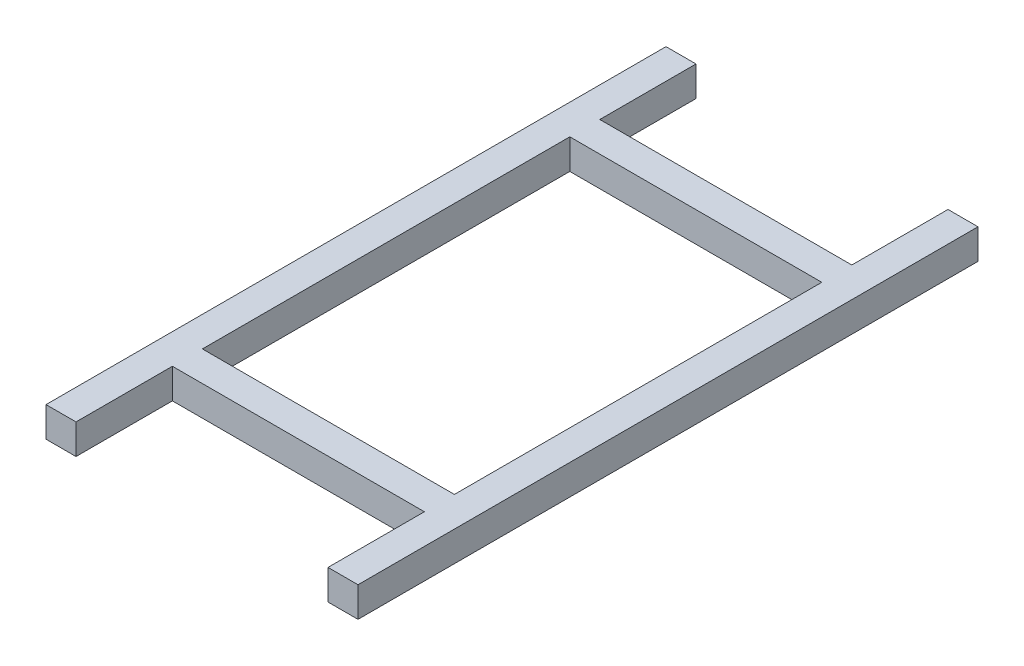
ISO-10303-21;
HEADER;
FILE_DESCRIPTION(('STEP AP214'),'2;1');
FILE_NAME('part.step','',(''),(''),'','','');
FILE_SCHEMA(('AUTOMOTIVE_DESIGN { 1 0 10303 214 1 1 1 1 }'));
ENDSEC;
DATA;
#1=APPLICATION_CONTEXT('core data for automotive mechanical design processes');
#2=APPLICATION_PROTOCOL_DEFINITION('international standard','automotive_design',2000,#1);
#3=PRODUCT_CONTEXT('',#1,'mechanical');
#4=PRODUCT('Part','Part','',(#3));
#5=PRODUCT_RELATED_PRODUCT_CATEGORY('part','',(#4));
#6=PRODUCT_DEFINITION_FORMATION('','',#4);
#7=PRODUCT_DEFINITION_CONTEXT('part definition',#1,'design');
#8=PRODUCT_DEFINITION('design','',#6,#7);
#9=PRODUCT_DEFINITION_SHAPE('','',#8);
#10=(LENGTH_UNIT() NAMED_UNIT(*) SI_UNIT(.MILLI.,.METRE.));
#11=(NAMED_UNIT(*) PLANE_ANGLE_UNIT() SI_UNIT($,.RADIAN.));
#12=(NAMED_UNIT(*) SI_UNIT($,.STERADIAN.) SOLID_ANGLE_UNIT());
#13=UNCERTAINTY_MEASURE_WITH_UNIT(LENGTH_MEASURE(1.E-05),#10,'distance_accuracy_value','');
#14=(GEOMETRIC_REPRESENTATION_CONTEXT(3) GLOBAL_UNCERTAINTY_ASSIGNED_CONTEXT((#13)) GLOBAL_UNIT_ASSIGNED_CONTEXT((#10,
#11,#12)) REPRESENTATION_CONTEXT('',''));
#15=CARTESIAN_POINT('',(0.,0.,0.));
#16=DIRECTION('',(0.,0.,1.));
#17=DIRECTION('',(1.,0.,0.));
#18=AXIS2_PLACEMENT_3D('',#15,#16,#17);
#19=CARTESIAN_POINT('',(80.1159358947742,31.4602637342031,3100.));
#20=DIRECTION('',(-1.,0.,0.));
#21=DIRECTION('',(0.,0.,1.));
#22=AXIS2_PLACEMENT_3D('',#19,#20,#21);
#23=PLANE('',#22);
#24=DIRECTION('',(0.,-1.,0.));
#25=VECTOR('',#24,1.);
#26=CARTESIAN_POINT('',(80.1159358947742,-118.539736265797,630.982528713376));
#27=LINE('',#26,#25);
#28=CARTESIAN_POINT('',(80.1159358947742,31.4602637342031,630.982528713376));
#29=VERTEX_POINT('',#28);
#30=CARTESIAN_POINT('',(80.1159358947742,-118.539736265797,630.982528713376));
#31=VERTEX_POINT('',#30);
#32=EDGE_CURVE('E167',#29,#31,#27,.T.);
#33=ORIENTED_EDGE('',*,*,#32,.F.);
#34=DIRECTION('',(0.,0.,-1.));
#35=VECTOR('',#34,1.);
#36=CARTESIAN_POINT('',(80.1159358947742,31.4602637342031,3100.));
#37=LINE('',#36,#35);
#38=CARTESIAN_POINT('',(80.1159358947742,31.4602637342031,2468.));
#39=VERTEX_POINT('',#38);
#40=EDGE_CURVE('E191',#39,#29,#37,.T.);
#41=ORIENTED_EDGE('',*,*,#40,.F.);
#42=DIRECTION('',(0.,1.,0.));
#43=VECTOR('',#42,1.);
#44=CARTESIAN_POINT('',(80.1159358947742,-118.539736265797,2468.));
#45=LINE('',#44,#43);
#46=CARTESIAN_POINT('',(80.1159358947742,-118.539736265797,2468.));
#47=VERTEX_POINT('',#46);
#48=EDGE_CURVE('E175',#47,#39,#45,.T.);
#49=ORIENTED_EDGE('',*,*,#48,.F.);
#50=DIRECTION('',(0.,0.,-1.));
#51=VECTOR('',#50,1.);
#52=CARTESIAN_POINT('',(80.1159358947742,-118.539736265797,3100.));
#53=LINE('',#52,#51);
#54=EDGE_CURVE('E158',#47,#31,#53,.T.);
#55=ORIENTED_EDGE('',*,*,#54,.T.);
#56=EDGE_LOOP('',(#33,#41,#49,#55));
#57=FACE_BOUND('',#56,.T.);
#58=ADVANCED_FACE('F34',(#57),#23,.F.);
#59=DIRECTION('',(0.,1.,0.));
#60=VECTOR('',#59,1.);
#61=CARTESIAN_POINT('',(80.1159358947742,-118.539736265797,480.982528713376));
#62=LINE('',#61,#60);
#63=CARTESIAN_POINT('',(80.1159358947742,-118.539736265797,480.982528713376));
#64=VERTEX_POINT('',#63);
#65=CARTESIAN_POINT('',(80.1159358947742,31.4602637342031,480.982528713376));
#66=VERTEX_POINT('',#65);
#67=EDGE_CURVE('E52',#64,#66,#62,.T.);
#68=ORIENTED_EDGE('',*,*,#67,.F.);
#69=CARTESIAN_POINT('',(80.1159358947742,-118.539736265797,0.));
#70=VERTEX_POINT('',#69);
#71=EDGE_CURVE('E38',#64,#70,#53,.T.);
#72=ORIENTED_EDGE('',*,*,#71,.T.);
#73=DIRECTION('',(0.,1.,0.));
#74=VECTOR('',#73,1.);
#75=CARTESIAN_POINT('',(80.1159358947742,31.4602637342031,0.));
#76=LINE('',#75,#74);
#77=CARTESIAN_POINT('',(80.1159358947742,31.4602637342031,0.));
#78=VERTEX_POINT('',#77);
#79=EDGE_CURVE('E274',#70,#78,#76,.T.);
#80=ORIENTED_EDGE('',*,*,#79,.T.);
#81=EDGE_CURVE('E192',#66,#78,#37,.T.);
#82=ORIENTED_EDGE('',*,*,#81,.F.);
#83=EDGE_LOOP('',(#68,#72,#80,#82));
#84=FACE_BOUND('',#83,.T.);
#85=ADVANCED_FACE('F271',(#84),#23,.F.);
#86=CARTESIAN_POINT('',(1340.11593589477,31.4602637342031,3100.));
#87=DIRECTION('',(1.,0.,0.));
#88=DIRECTION('',(0.,0.,-1.));
#89=AXIS2_PLACEMENT_3D('',#86,#87,#88);
#90=PLANE('',#89);
#91=DIRECTION('',(0.,-1.,0.));
#92=VECTOR('',#91,1.);
#93=CARTESIAN_POINT('',(1340.1159358948,-118.539736265797,630.982528713376));
#94=LINE('',#93,#92);
#95=CARTESIAN_POINT('',(1340.11593589477,31.4602637342031,630.982528713376));
#96=VERTEX_POINT('',#95);
#97=CARTESIAN_POINT('',(1340.11593589477,-118.539736265797,630.982528713376));
#98=VERTEX_POINT('',#97);
#99=EDGE_CURVE('E163',#96,#98,#94,.T.);
#100=ORIENTED_EDGE('',*,*,#99,.T.);
#101=DIRECTION('',(0.,0.,-1.));
#102=VECTOR('',#101,1.);
#103=CARTESIAN_POINT('',(1340.11593589477,-118.539736265797,3100.));
#104=LINE('',#103,#102);
#105=CARTESIAN_POINT('',(1340.1159358948,-118.539736265797,2468.));
#106=VERTEX_POINT('',#105);
#107=EDGE_CURVE('E161',#106,#98,#104,.T.);
#108=ORIENTED_EDGE('',*,*,#107,.F.);
#109=DIRECTION('',(0.,1.,0.));
#110=VECTOR('',#109,1.);
#111=CARTESIAN_POINT('',(1340.1159358948,-118.539736265797,2468.));
#112=LINE('',#111,#110);
#113=CARTESIAN_POINT('',(1340.11593589477,31.4602637342031,2468.));
#114=VERTEX_POINT('',#113);
#115=EDGE_CURVE('E294',#106,#114,#112,.T.);
#116=ORIENTED_EDGE('',*,*,#115,.T.);
#117=DIRECTION('',(0.,0.,-1.));
#118=VECTOR('',#117,1.);
#119=CARTESIAN_POINT('',(1340.11593589477,31.4602637342031,3100.));
#120=LINE('',#119,#118);
#121=EDGE_CURVE('E60',#114,#96,#120,.T.);
#122=ORIENTED_EDGE('',*,*,#121,.T.);
#123=EDGE_LOOP('',(#100,#108,#116,#122));
#124=FACE_BOUND('',#123,.T.);
#125=ADVANCED_FACE('F355',(#124),#90,.F.);
#126=DIRECTION('',(0.,1.,0.));
#127=VECTOR('',#126,1.);
#128=CARTESIAN_POINT('',(1340.1159358948,-118.539736265797,480.982528713376));
#129=LINE('',#128,#127);
#130=CARTESIAN_POINT('',(1340.11593589477,-118.539736265797,480.982528713376));
#131=VERTEX_POINT('',#130);
#132=CARTESIAN_POINT('',(1340.1159358948,31.4602637342031,480.982528713376));
#133=VERTEX_POINT('',#132);
#134=EDGE_CURVE('E257',#131,#133,#129,.T.);
#135=ORIENTED_EDGE('',*,*,#134,.T.);
#136=CARTESIAN_POINT('',(1340.11593589477,31.4602637342031,0.));
#137=VERTEX_POINT('',#136);
#138=EDGE_CURVE('E202',#133,#137,#120,.T.);
#139=ORIENTED_EDGE('',*,*,#138,.T.);
#140=DIRECTION('',(0.,-1.,0.));
#141=VECTOR('',#140,1.);
#142=CARTESIAN_POINT('',(1340.11593589477,31.4602637342031,0.));
#143=LINE('',#142,#141);
#144=CARTESIAN_POINT('',(1340.11593589477,-118.539736265797,0.));
#145=VERTEX_POINT('',#144);
#146=EDGE_CURVE('E248',#137,#145,#143,.T.);
#147=ORIENTED_EDGE('',*,*,#146,.T.);
#148=EDGE_CURVE('E206',#131,#145,#104,.T.);
#149=ORIENTED_EDGE('',*,*,#148,.F.);
#150=EDGE_LOOP('',(#135,#139,#147,#149));
#151=FACE_BOUND('',#150,.T.);
#152=ADVANCED_FACE('F349',(#151),#90,.F.);
#153=DIRECTION('',(0.,-1.,0.));
#154=VECTOR('',#153,1.);
#155=CARTESIAN_POINT('',(80.1159358947742,-118.539736265797,2618.));
#156=LINE('',#155,#154);
#157=CARTESIAN_POINT('',(80.1159358947742,31.4602637342031,2618.));
#158=VERTEX_POINT('',#157);
#159=CARTESIAN_POINT('',(80.1159358947742,-118.539736265797,2618.));
#160=VERTEX_POINT('',#159);
#161=EDGE_CURVE('E313',#158,#160,#156,.T.);
#162=ORIENTED_EDGE('',*,*,#161,.F.);
#163=CARTESIAN_POINT('',(80.1159358947742,31.4602637342031,3100.));
#164=VERTEX_POINT('',#163);
#165=EDGE_CURVE('E178',#164,#158,#37,.T.);
#166=ORIENTED_EDGE('',*,*,#165,.F.);
#167=DIRECTION('',(0.,1.,0.));
#168=VECTOR('',#167,1.);
#169=CARTESIAN_POINT('',(80.1159358947742,31.4602637342031,3100.));
#170=LINE('',#169,#168);
#171=CARTESIAN_POINT('',(80.1159358947742,-118.539736265797,3100.));
#172=VERTEX_POINT('',#171);
#173=EDGE_CURVE('E296',#172,#164,#170,.T.);
#174=ORIENTED_EDGE('',*,*,#173,.F.);
#175=EDGE_CURVE('E44',#172,#160,#53,.T.);
#176=ORIENTED_EDGE('',*,*,#175,.T.);
#177=EDGE_LOOP('',(#162,#166,#174,#176));
#178=FACE_BOUND('',#177,.T.);
#179=ADVANCED_FACE('F337',(#178),#23,.F.);
#180=CARTESIAN_POINT('',(-69.8840641052258,31.4602637342031,3100.));
#181=DIRECTION('',(1.,0.,0.));
#182=DIRECTION('',(0.,0.,-1.));
#183=AXIS2_PLACEMENT_3D('',#180,#181,#182);
#184=PLANE('',#183);
#185=DIRECTION('',(0.,-1.,0.));
#186=VECTOR('',#185,1.);
#187=CARTESIAN_POINT('',(-69.8840641052258,31.4602637342031,0.));
#188=LINE('',#187,#186);
#189=CARTESIAN_POINT('',(-69.8840641052258,31.4602637342031,0.));
#190=VERTEX_POINT('',#189);
#191=CARTESIAN_POINT('',(-69.8840641052258,-118.539736265797,0.));
#192=VERTEX_POINT('',#191);
#193=EDGE_CURVE('E284',#190,#192,#188,.T.);
#194=ORIENTED_EDGE('',*,*,#193,.T.);
#195=DIRECTION('',(0.,0.,-1.));
#196=VECTOR('',#195,1.);
#197=CARTESIAN_POINT('',(-69.8840641052258,-118.539736265797,3100.));
#198=LINE('',#197,#196);
#199=CARTESIAN_POINT('',(-69.8840641052258,-118.539736265797,3100.));
#200=VERTEX_POINT('',#199);
#201=EDGE_CURVE('E11',#200,#192,#198,.T.);
#202=ORIENTED_EDGE('',*,*,#201,.F.);
#203=DIRECTION('',(0.,-1.,0.));
#204=VECTOR('',#203,1.);
#205=CARTESIAN_POINT('',(-69.8840641052258,31.4602637342031,3100.));
#206=LINE('',#205,#204);
#207=CARTESIAN_POINT('',(-69.8840641052258,31.4602637342031,3100.));
#208=VERTEX_POINT('',#207);
#209=EDGE_CURVE('E286',#208,#200,#206,.T.);
#210=ORIENTED_EDGE('',*,*,#209,.F.);
#211=DIRECTION('',(0.,0.,-1.));
#212=VECTOR('',#211,1.);
#213=CARTESIAN_POINT('',(-69.8840641052258,31.4602637342031,3100.));
#214=LINE('',#213,#212);
#215=EDGE_CURVE('E195',#208,#190,#214,.T.);
#216=ORIENTED_EDGE('',*,*,#215,.T.);
#217=EDGE_LOOP('',(#194,#202,#210,#216));
#218=FACE_BOUND('',#217,.T.);
#219=ADVANCED_FACE('F36',(#218),#184,.F.);
#220=CARTESIAN_POINT('',(-69.8840641052258,-118.539736265797,3100.));
#221=DIRECTION('',(0.,1.,0.));
#222=DIRECTION('',(0.,0.,1.));
#223=AXIS2_PLACEMENT_3D('',#220,#221,#222);
#224=PLANE('',#223);
#225=ORIENTED_EDGE('',*,*,#71,.F.);
#226=DIRECTION('',(-1.,0.,0.));
#227=VECTOR('',#226,1.);
#228=CARTESIAN_POINT('',(500000.,-118.539736265797,480.982528713376));
#229=LINE('',#228,#227);
#230=EDGE_CURVE('E164',#131,#64,#229,.T.);
#231=ORIENTED_EDGE('',*,*,#230,.F.);
#232=ORIENTED_EDGE('',*,*,#148,.T.);
#233=DIRECTION('',(1.,0.,0.));
#234=VECTOR('',#233,1.);
#235=CARTESIAN_POINT('',(1340.11593589477,-118.539736265797,0.));
#236=LINE('',#235,#234);
#237=CARTESIAN_POINT('',(1490.11593589477,-118.539736265797,0.));
#238=VERTEX_POINT('',#237);
#239=EDGE_CURVE('E253',#145,#238,#236,.T.);
#240=ORIENTED_EDGE('',*,*,#239,.T.);
#241=DIRECTION('',(0.,0.,-1.));
#242=VECTOR('',#241,1.);
#243=CARTESIAN_POINT('',(1490.11593589477,-118.539736265797,3100.));
#244=LINE('',#243,#242);
#245=CARTESIAN_POINT('',(1490.11593589477,-118.539736265797,3100.));
#246=VERTEX_POINT('',#245);
#247=EDGE_CURVE('E227',#246,#238,#244,.T.);
#248=ORIENTED_EDGE('',*,*,#247,.F.);
#249=DIRECTION('',(1.,0.,0.));
#250=VECTOR('',#249,1.);
#251=CARTESIAN_POINT('',(1340.11593589477,-118.539736265797,3100.));
#252=LINE('',#251,#250);
#253=CARTESIAN_POINT('',(1340.11593589477,-118.539736265797,3100.));
#254=VERTEX_POINT('',#253);
#255=EDGE_CURVE('E251',#254,#246,#252,.T.);
#256=ORIENTED_EDGE('',*,*,#255,.F.);
#257=CARTESIAN_POINT('',(1340.1159358948,-118.539736265797,2618.));
#258=VERTEX_POINT('',#257);
#259=EDGE_CURVE('E225',#254,#258,#104,.T.);
#260=ORIENTED_EDGE('',*,*,#259,.T.);
#261=DIRECTION('',(-1.,0.,0.));
#262=VECTOR('',#261,1.);
#263=CARTESIAN_POINT('',(500000.,-118.539736265797,2618.));
#264=LINE('',#263,#262);
#265=EDGE_CURVE('E306',#258,#160,#264,.T.);
#266=ORIENTED_EDGE('',*,*,#265,.T.);
#267=ORIENTED_EDGE('',*,*,#175,.F.);
#268=DIRECTION('',(1.,0.,0.));
#269=VECTOR('',#268,1.);
#270=CARTESIAN_POINT('',(-69.8840641052258,-118.539736265797,3100.));
#271=LINE('',#270,#269);
#272=EDGE_CURVE('E289',#200,#172,#271,.T.);
#273=ORIENTED_EDGE('',*,*,#272,.F.);
#274=ORIENTED_EDGE('',*,*,#201,.T.);
#275=DIRECTION('',(1.,0.,0.));
#276=VECTOR('',#275,1.);
#277=CARTESIAN_POINT('',(-69.8840641052258,-118.539736265797,0.));
#278=LINE('',#277,#276);
#279=EDGE_CURVE('E279',#192,#70,#278,.T.);
#280=ORIENTED_EDGE('',*,*,#279,.T.);
#281=EDGE_LOOP('',(#225,#231,#232,#240,#248,#256,#260,#266,#267,#273,#274,#280));
#282=FACE_BOUND('',#281,.T.);
#283=DIRECTION('',(-1.,0.,0.));
#284=VECTOR('',#283,1.);
#285=CARTESIAN_POINT('',(500000.,-118.539736265797,630.982528713376));
#286=LINE('',#285,#284);
#287=EDGE_CURVE('E153',#98,#31,#286,.T.);
#288=ORIENTED_EDGE('',*,*,#287,.T.);
#289=ORIENTED_EDGE('',*,*,#54,.F.);
#290=DIRECTION('',(-1.,0.,0.));
#291=VECTOR('',#290,1.);
#292=CARTESIAN_POINT('',(500000.,-118.539736265797,2468.));
#293=LINE('',#292,#291);
#294=EDGE_CURVE('E323',#106,#47,#293,.T.);
#295=ORIENTED_EDGE('',*,*,#294,.F.);
#296=ORIENTED_EDGE('',*,*,#107,.T.);
#297=EDGE_LOOP('',(#288,#289,#295,#296));
#298=FACE_BOUND('',#297,.T.);
#299=ADVANCED_FACE('F155',(#282,#298),#224,.F.);
#300=CARTESIAN_POINT('',(-69.8840641052258,31.4602637342031,3100.));
#301=DIRECTION('',(0.,-1.,0.));
#302=DIRECTION('',(0.,0.,-1.));
#303=AXIS2_PLACEMENT_3D('',#300,#301,#302);
#304=PLANE('',#303);
#305=ORIENTED_EDGE('',*,*,#40,.T.);
#306=DIRECTION('',(-1.,0.,0.));
#307=VECTOR('',#306,1.);
#308=CARTESIAN_POINT('',(500000.,31.4602637342031,630.982528713376));
#309=LINE('',#308,#307);
#310=EDGE_CURVE('E170',#96,#29,#309,.T.);
#311=ORIENTED_EDGE('',*,*,#310,.F.);
#312=ORIENTED_EDGE('',*,*,#121,.F.);
#313=DIRECTION('',(-1.,0.,0.));
#314=VECTOR('',#313,1.);
#315=CARTESIAN_POINT('',(500000.,31.4602637342031,2468.));
#316=LINE('',#315,#314);
#317=EDGE_CURVE('E181',#114,#39,#316,.T.);
#318=ORIENTED_EDGE('',*,*,#317,.T.);
#319=EDGE_LOOP('',(#305,#311,#312,#318));
#320=FACE_BOUND('',#319,.T.);
#321=DIRECTION('',(-1.,0.,0.));
#322=VECTOR('',#321,1.);
#323=CARTESIAN_POINT('',(-69.8840641052258,31.4602637342031,0.));
#324=LINE('',#323,#322);
#325=EDGE_CURVE('E278',#78,#190,#324,.T.);
#326=ORIENTED_EDGE('',*,*,#325,.T.);
#327=ORIENTED_EDGE('',*,*,#215,.F.);
#328=DIRECTION('',(-1.,0.,0.));
#329=VECTOR('',#328,1.);
#330=CARTESIAN_POINT('',(-69.8840641052258,31.4602637342031,3100.));
#331=LINE('',#330,#329);
#332=EDGE_CURVE('E200',#164,#208,#331,.T.);
#333=ORIENTED_EDGE('',*,*,#332,.F.);
#334=ORIENTED_EDGE('',*,*,#165,.T.);
#335=DIRECTION('',(-1.,0.,0.));
#336=VECTOR('',#335,1.);
#337=CARTESIAN_POINT('',(500000.,31.4602637342031,2618.));
#338=LINE('',#337,#336);
#339=CARTESIAN_POINT('',(1340.1159358948,31.4602637342031,2618.));
#340=VERTEX_POINT('',#339);
#341=EDGE_CURVE('E310',#340,#158,#338,.T.);
#342=ORIENTED_EDGE('',*,*,#341,.F.);
#343=CARTESIAN_POINT('',(1340.11593589477,31.4602637342031,3100.));
#344=VERTEX_POINT('',#343);
#345=EDGE_CURVE('E221',#344,#340,#120,.T.);
#346=ORIENTED_EDGE('',*,*,#345,.F.);
#347=DIRECTION('',(-1.,0.,0.));
#348=VECTOR('',#347,1.);
#349=CARTESIAN_POINT('',(1340.11593589477,31.4602637342031,3100.));
#350=LINE('',#349,#348);
#351=CARTESIAN_POINT('',(1490.11593589477,31.4602637342031,3100.));
#352=VERTEX_POINT('',#351);
#353=EDGE_CURVE('E205',#352,#344,#350,.T.);
#354=ORIENTED_EDGE('',*,*,#353,.F.);
#355=DIRECTION('',(0.,0.,-1.));
#356=VECTOR('',#355,1.);
#357=CARTESIAN_POINT('',(1490.11593589477,31.4602637342031,3100.));
#358=LINE('',#357,#356);
#359=CARTESIAN_POINT('',(1490.11593589477,31.4602637342031,0.));
#360=VERTEX_POINT('',#359);
#361=EDGE_CURVE('E214',#352,#360,#358,.T.);
#362=ORIENTED_EDGE('',*,*,#361,.T.);
#363=DIRECTION('',(-1.,0.,0.));
#364=VECTOR('',#363,1.);
#365=CARTESIAN_POINT('',(1340.11593589477,31.4602637342031,0.));
#366=LINE('',#365,#364);
#367=EDGE_CURVE('E212',#360,#137,#366,.T.);
#368=ORIENTED_EDGE('',*,*,#367,.T.);
#369=ORIENTED_EDGE('',*,*,#138,.F.);
#370=DIRECTION('',(-1.,0.,0.));
#371=VECTOR('',#370,1.);
#372=CARTESIAN_POINT('',(500000.,31.4602637342031,480.982528713376));
#373=LINE('',#372,#371);
#374=EDGE_CURVE('E266',#133,#66,#373,.T.);
#375=ORIENTED_EDGE('',*,*,#374,.T.);
#376=ORIENTED_EDGE('',*,*,#81,.T.);
#377=EDGE_LOOP('',(#326,#327,#333,#334,#342,#346,#354,#362,#368,#369,#375,#376));
#378=FACE_BOUND('',#377,.T.);
#379=ADVANCED_FACE('F240',(#320,#378),#304,.F.);
#380=CARTESIAN_POINT('',(-69.8840641052258,-118.539736265797,3100.));
#381=DIRECTION('',(0.,0.,1.));
#382=DIRECTION('',(1.,0.,0.));
#383=AXIS2_PLACEMENT_3D('',#380,#381,#382);
#384=PLANE('',#383);
#385=ORIENTED_EDGE('',*,*,#209,.T.);
#386=ORIENTED_EDGE('',*,*,#272,.T.);
#387=ORIENTED_EDGE('',*,*,#173,.T.);
#388=ORIENTED_EDGE('',*,*,#332,.T.);
#389=EDGE_LOOP('',(#385,#386,#387,#388));
#390=FACE_BOUND('',#389,.T.);
#391=ADVANCED_FACE('F341',(#390),#384,.T.);
#392=CARTESIAN_POINT('',(-69.8840641052258,-118.539736265797,0.));
#393=DIRECTION('',(0.,0.,1.));
#394=DIRECTION('',(1.,0.,0.));
#395=AXIS2_PLACEMENT_3D('',#392,#393,#394);
#396=PLANE('',#395);
#397=ORIENTED_EDGE('',*,*,#193,.F.);
#398=ORIENTED_EDGE('',*,*,#325,.F.);
#399=ORIENTED_EDGE('',*,*,#79,.F.);
#400=ORIENTED_EDGE('',*,*,#279,.F.);
#401=EDGE_LOOP('',(#397,#398,#399,#400));
#402=FACE_BOUND('',#401,.T.);
#403=ADVANCED_FACE('F282',(#402),#396,.F.);
#404=CARTESIAN_POINT('',(500000.,-118.539736265797,2618.));
#405=DIRECTION('',(0.,0.,-1.));
#406=DIRECTION('',(-1.,0.,0.));
#407=AXIS2_PLACEMENT_3D('',#404,#405,#406);
#408=PLANE('',#407);
#409=DIRECTION('',(0.,-1.,0.));
#410=VECTOR('',#409,1.);
#411=CARTESIAN_POINT('',(1340.1159358948,-118.539736265797,2618.));
#412=LINE('',#411,#410);
#413=EDGE_CURVE('E303',#340,#258,#412,.T.);
#414=ORIENTED_EDGE('',*,*,#413,.F.);
#415=ORIENTED_EDGE('',*,*,#341,.T.);
#416=ORIENTED_EDGE('',*,*,#161,.T.);
#417=ORIENTED_EDGE('',*,*,#265,.F.);
#418=EDGE_LOOP('',(#414,#415,#416,#417));
#419=FACE_BOUND('',#418,.T.);
#420=ADVANCED_FACE('F333',(#419),#408,.F.);
#421=CARTESIAN_POINT('',(500000.,-118.539736265797,2468.));
#422=DIRECTION('',(0.,0.,1.));
#423=DIRECTION('',(1.,0.,0.));
#424=AXIS2_PLACEMENT_3D('',#421,#422,#423);
#425=PLANE('',#424);
#426=ORIENTED_EDGE('',*,*,#115,.F.);
#427=ORIENTED_EDGE('',*,*,#294,.T.);
#428=ORIENTED_EDGE('',*,*,#48,.T.);
#429=ORIENTED_EDGE('',*,*,#317,.F.);
#430=EDGE_LOOP('',(#426,#427,#428,#429));
#431=FACE_BOUND('',#430,.T.);
#432=ADVANCED_FACE('F361',(#431),#425,.F.);
#433=ORIENTED_EDGE('',*,*,#345,.T.);
#434=ORIENTED_EDGE('',*,*,#413,.T.);
#435=ORIENTED_EDGE('',*,*,#259,.F.);
#436=DIRECTION('',(0.,-1.,0.));
#437=VECTOR('',#436,1.);
#438=CARTESIAN_POINT('',(1340.11593589477,31.4602637342031,3100.));
#439=LINE('',#438,#437);
#440=EDGE_CURVE('E249',#344,#254,#439,.T.);
#441=ORIENTED_EDGE('',*,*,#440,.F.);
#442=EDGE_LOOP('',(#433,#434,#435,#441));
#443=FACE_BOUND('',#442,.T.);
#444=ADVANCED_FACE('F366',(#443),#90,.F.);
#445=CARTESIAN_POINT('',(1490.11593589477,31.4602637342031,3100.));
#446=DIRECTION('',(-1.,0.,0.));
#447=DIRECTION('',(0.,0.,1.));
#448=AXIS2_PLACEMENT_3D('',#445,#446,#447);
#449=PLANE('',#448);
#450=DIRECTION('',(0.,1.,0.));
#451=VECTOR('',#450,1.);
#452=CARTESIAN_POINT('',(1490.11593589477,31.4602637342031,0.));
#453=LINE('',#452,#451);
#454=EDGE_CURVE('E246',#238,#360,#453,.T.);
#455=ORIENTED_EDGE('',*,*,#454,.T.);
#456=ORIENTED_EDGE('',*,*,#361,.F.);
#457=DIRECTION('',(0.,1.,0.));
#458=VECTOR('',#457,1.);
#459=CARTESIAN_POINT('',(1490.11593589477,31.4602637342031,3100.));
#460=LINE('',#459,#458);
#461=EDGE_CURVE('E259',#246,#352,#460,.T.);
#462=ORIENTED_EDGE('',*,*,#461,.F.);
#463=ORIENTED_EDGE('',*,*,#247,.T.);
#464=EDGE_LOOP('',(#455,#456,#462,#463));
#465=FACE_BOUND('',#464,.T.);
#466=ADVANCED_FACE('F372',(#465),#449,.F.);
#467=CARTESIAN_POINT('',(1340.11593589477,-118.539736265797,3100.));
#468=DIRECTION('',(0.,0.,1.));
#469=DIRECTION('',(1.,0.,0.));
#470=AXIS2_PLACEMENT_3D('',#467,#468,#469);
#471=PLANE('',#470);
#472=ORIENTED_EDGE('',*,*,#440,.T.);
#473=ORIENTED_EDGE('',*,*,#255,.T.);
#474=ORIENTED_EDGE('',*,*,#461,.T.);
#475=ORIENTED_EDGE('',*,*,#353,.T.);
#476=EDGE_LOOP('',(#472,#473,#474,#475));
#477=FACE_BOUND('',#476,.T.);
#478=ADVANCED_FACE('F376',(#477),#471,.T.);
#479=CARTESIAN_POINT('',(1340.11593589477,-118.539736265797,0.));
#480=DIRECTION('',(0.,0.,1.));
#481=DIRECTION('',(1.,0.,0.));
#482=AXIS2_PLACEMENT_3D('',#479,#480,#481);
#483=PLANE('',#482);
#484=ORIENTED_EDGE('',*,*,#146,.F.);
#485=ORIENTED_EDGE('',*,*,#367,.F.);
#486=ORIENTED_EDGE('',*,*,#454,.F.);
#487=ORIENTED_EDGE('',*,*,#239,.F.);
#488=EDGE_LOOP('',(#484,#485,#486,#487));
#489=FACE_BOUND('',#488,.T.);
#490=ADVANCED_FACE('F244',(#489),#483,.F.);
#491=CARTESIAN_POINT('',(500000.,-118.539736265797,630.982528713376));
#492=DIRECTION('',(0.,0.,-1.));
#493=DIRECTION('',(-1.,0.,0.));
#494=AXIS2_PLACEMENT_3D('',#491,#492,#493);
#495=PLANE('',#494);
#496=ORIENTED_EDGE('',*,*,#99,.F.);
#497=ORIENTED_EDGE('',*,*,#310,.T.);
#498=ORIENTED_EDGE('',*,*,#32,.T.);
#499=ORIENTED_EDGE('',*,*,#287,.F.);
#500=EDGE_LOOP('',(#496,#497,#498,#499));
#501=FACE_BOUND('',#500,.T.);
#502=ADVANCED_FACE('F168',(#501),#495,.F.);
#503=CARTESIAN_POINT('',(500000.,-118.539736265797,480.982528713376));
#504=DIRECTION('',(0.,0.,1.));
#505=DIRECTION('',(1.,0.,0.));
#506=AXIS2_PLACEMENT_3D('',#503,#504,#505);
#507=PLANE('',#506);
#508=ORIENTED_EDGE('',*,*,#134,.F.);
#509=ORIENTED_EDGE('',*,*,#230,.T.);
#510=ORIENTED_EDGE('',*,*,#67,.T.);
#511=ORIENTED_EDGE('',*,*,#374,.F.);
#512=EDGE_LOOP('',(#508,#509,#510,#511));
#513=FACE_BOUND('',#512,.T.);
#514=ADVANCED_FACE('F379',(#513),#507,.F.);
#515=CLOSED_SHELL('',(#58,#85,#125,#152,#179,#219,#299,#379,#391,#403,#420,#432,#444,#466,#478,
#490,#502,#514));
#516=MANIFOLD_SOLID_BREP('B2',#515);
#517=ADVANCED_BREP_SHAPE_REPRESENTATION('',(#18,#516),#14);
#518=SHAPE_DEFINITION_REPRESENTATION(#9,#517);
ENDSEC;
END-ISO-10303-21;
